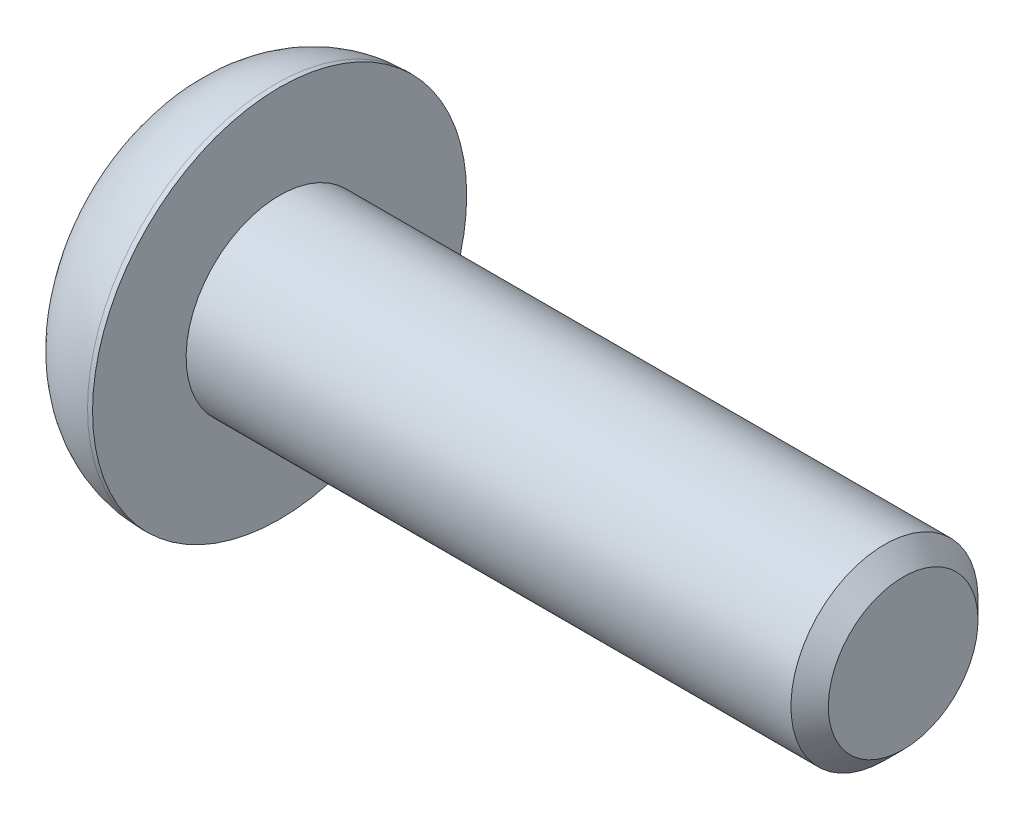
ISO-10303-21;
HEADER;
FILE_DESCRIPTION(('STEP AP214'),'2;1');
FILE_NAME('part.step','',(''),(''),'','','');
FILE_SCHEMA(('AUTOMOTIVE_DESIGN { 1 0 10303 214 1 1 1 1 }'));
ENDSEC;
DATA;
#1=APPLICATION_CONTEXT('core data for automotive mechanical design processes');
#2=APPLICATION_PROTOCOL_DEFINITION('international standard','automotive_design',2000,#1);
#3=PRODUCT_CONTEXT('',#1,'mechanical');
#4=PRODUCT('Part','Part','',(#3));
#5=PRODUCT_RELATED_PRODUCT_CATEGORY('part','',(#4));
#6=PRODUCT_DEFINITION_FORMATION('','',#4);
#7=PRODUCT_DEFINITION_CONTEXT('part definition',#1,'design');
#8=PRODUCT_DEFINITION('design','',#6,#7);
#9=PRODUCT_DEFINITION_SHAPE('','',#8);
#10=(LENGTH_UNIT() NAMED_UNIT(*) SI_UNIT(.MILLI.,.METRE.));
#11=(NAMED_UNIT(*) PLANE_ANGLE_UNIT() SI_UNIT($,.RADIAN.));
#12=(NAMED_UNIT(*) SI_UNIT($,.STERADIAN.) SOLID_ANGLE_UNIT());
#13=UNCERTAINTY_MEASURE_WITH_UNIT(LENGTH_MEASURE(1.E-05),#10,'distance_accuracy_value','');
#14=(GEOMETRIC_REPRESENTATION_CONTEXT(3) GLOBAL_UNCERTAINTY_ASSIGNED_CONTEXT((#13)) GLOBAL_UNIT_ASSIGNED_CONTEXT((#10,
#11,#12)) REPRESENTATION_CONTEXT('',''));
#15=CARTESIAN_POINT('',(0.,0.,0.));
#16=DIRECTION('',(0.,0.,1.));
#17=DIRECTION('',(1.,0.,0.));
#18=AXIS2_PLACEMENT_3D('',#15,#16,#17);
#19=CARTESIAN_POINT('',(1.66,0.,0.));
#20=DIRECTION('',(1.,0.,0.));
#21=DIRECTION('',(0.,1.,0.));
#22=AXIS2_PLACEMENT_3D('',#19,#20,#21);
#23=CYLINDRICAL_SURFACE('',#22,3.);
#24=CARTESIAN_POINT('',(1.7,0.,0.));
#25=DIRECTION('',(1.,0.,0.));
#26=DIRECTION('',(0.,-1.,0.));
#27=AXIS2_PLACEMENT_3D('',#24,#25,#26);
#28=CIRCLE('',#27,3.);
#29=CARTESIAN_POINT('',(1.7,-3.,0.));
#30=VERTEX_POINT('',#29);
#31=EDGE_CURVE('E11',#30,#30,#28,.T.);
#32=ORIENTED_EDGE('',*,*,#31,.F.);
#33=EDGE_LOOP('',(#32));
#34=FACE_BOUND('',#33,.T.);
#35=CARTESIAN_POINT('',(1.62,0.,0.));
#36=DIRECTION('',(-1.,0.,0.));
#37=DIRECTION('',(0.,0.,-1.));
#38=AXIS2_PLACEMENT_3D('',#35,#36,#37);
#39=CIRCLE('',#38,3.);
#40=CARTESIAN_POINT('',(1.62,0.,-3.));
#41=VERTEX_POINT('',#40);
#42=EDGE_CURVE('E212',#41,#41,#39,.T.);
#43=ORIENTED_EDGE('',*,*,#42,.F.);
#44=EDGE_LOOP('',(#43));
#45=FACE_BOUND('',#44,.T.);
#46=ADVANCED_FACE('F17',(#34,#45),#23,.T.);
#47=CARTESIAN_POINT('',(1.7,2.25,0.));
#48=DIRECTION('',(1.,0.,0.));
#49=DIRECTION('',(0.,-1.,0.));
#50=AXIS2_PLACEMENT_3D('',#47,#48,#49);
#51=PLANE('',#50);
#52=ORIENTED_EDGE('',*,*,#31,.T.);
#53=EDGE_LOOP('',(#52));
#54=FACE_BOUND('',#53,.T.);
#55=CARTESIAN_POINT('',(1.7,0.,0.));
#56=DIRECTION('',(-1.,0.,0.));
#57=DIRECTION('',(0.,-1.,0.));
#58=AXIS2_PLACEMENT_3D('',#55,#56,#57);
#59=CIRCLE('',#58,1.5);
#60=CARTESIAN_POINT('',(1.7,-1.5,0.));
#61=VERTEX_POINT('',#60);
#62=EDGE_CURVE('E27',#61,#61,#59,.T.);
#63=ORIENTED_EDGE('',*,*,#62,.T.);
#64=EDGE_LOOP('',(#63));
#65=FACE_BOUND('',#64,.T.);
#66=ADVANCED_FACE('F229',(#54,#65),#51,.T.);
#67=CARTESIAN_POINT('',(5.69675,0.,0.));
#68=DIRECTION('',(1.,0.,0.));
#69=DIRECTION('',(0.,1.,0.));
#70=AXIS2_PLACEMENT_3D('',#67,#68,#69);
#71=CYLINDRICAL_SURFACE('',#70,1.5);
#72=CARTESIAN_POINT('',(11.4,0.,0.));
#73=DIRECTION('',(1.,0.,0.));
#74=DIRECTION('',(0.,-1.,0.));
#75=AXIS2_PLACEMENT_3D('',#72,#73,#74);
#76=CIRCLE('',#75,1.5);
#77=CARTESIAN_POINT('',(11.4,-1.5,0.));
#78=VERTEX_POINT('',#77);
#79=EDGE_CURVE('E218',#78,#78,#76,.T.);
#80=ORIENTED_EDGE('',*,*,#79,.F.);
#81=EDGE_LOOP('',(#80));
#82=FACE_BOUND('',#81,.T.);
#83=ORIENTED_EDGE('',*,*,#62,.F.);
#84=EDGE_LOOP('',(#83));
#85=FACE_BOUND('',#84,.T.);
#86=ADVANCED_FACE('F236',(#82,#85),#71,.T.);
#87=CARTESIAN_POINT('',(11.55000000005,0.,0.));
#88=DIRECTION('',(-1.,0.,0.));
#89=DIRECTION('',(0.,0.,-1.));
#90=AXIS2_PLACEMENT_3D('',#87,#88,#89);
#91=CONICAL_SURFACE('',#90,1.349999999949,0.7853981633973);
#92=ORIENTED_EDGE('',*,*,#79,.T.);
#93=EDGE_LOOP('',(#92));
#94=FACE_BOUND('',#93,.T.);
#95=CARTESIAN_POINT('',(11.7,0.,0.));
#96=DIRECTION('',(1.,0.,0.));
#97=DIRECTION('',(0.,-1.,0.));
#98=AXIS2_PLACEMENT_3D('',#95,#96,#97);
#99=CIRCLE('',#98,1.2);
#100=CARTESIAN_POINT('',(11.7,-1.2,0.));
#101=VERTEX_POINT('',#100);
#102=EDGE_CURVE('E215',#101,#101,#99,.T.);
#103=ORIENTED_EDGE('',*,*,#102,.F.);
#104=EDGE_LOOP('',(#103));
#105=FACE_BOUND('',#104,.T.);
#106=ADVANCED_FACE('F243',(#94,#105),#91,.T.);
#107=CARTESIAN_POINT('',(11.7,0.,0.));
#108=DIRECTION('',(1.,0.,0.));
#109=DIRECTION('',(0.,1.,0.));
#110=AXIS2_PLACEMENT_3D('',#107,#108,#109);
#111=PLANE('',#110);
#112=ORIENTED_EDGE('',*,*,#102,.T.);
#113=EDGE_LOOP('',(#112));
#114=FACE_BOUND('',#113,.T.);
#115=ADVANCED_FACE('F247',(#114),#111,.T.);
#116=CARTESIAN_POINT('',(1.62000000000068,4.34114549863196E-13,0.));
#117=DIRECTION('',(-1.,0.,0.));
#118=DIRECTION('',(0.,0.,1.));
#119=AXIS2_PLACEMENT_3D('',#116,#117,#118);
#120=DEGENERATE_TOROIDAL_SURFACE('',#119,1.37999999999966,1.62000000000062,.T.);
#121=ORIENTED_EDGE('',*,*,#42,.T.);
#122=EDGE_LOOP('',(#121));
#123=FACE_BOUND('',#122,.T.);
#124=CARTESIAN_POINT('',(0.,0.,0.));
#125=DIRECTION('',(-1.,0.,0.));
#126=DIRECTION('',(0.,-1.,0.));
#127=AXIS2_PLACEMENT_3D('',#124,#125,#126);
#128=CIRCLE('',#127,1.38);
#129=CARTESIAN_POINT('',(0.,-1.38,0.));
#130=VERTEX_POINT('',#129);
#131=EDGE_CURVE('E210',#130,#130,#128,.T.);
#132=ORIENTED_EDGE('',*,*,#131,.F.);
#133=EDGE_LOOP('',(#132));
#134=FACE_BOUND('',#133,.T.);
#135=ADVANCED_FACE('F19',(#123,#134),#120,.T.);
#136=CARTESIAN_POINT('',(0.,0.69,0.));
#137=DIRECTION('',(-1.,0.,0.));
#138=DIRECTION('',(0.,1.,0.));
#139=AXIS2_PLACEMENT_3D('',#136,#137,#138);
#140=PLANE('',#139);
#141=ORIENTED_EDGE('',*,*,#131,.T.);
#142=EDGE_LOOP('',(#141));
#143=FACE_BOUND('',#142,.T.);
#144=DIRECTION('',(0.,-0.500000000000017,-0.866025403784429));
#145=VECTOR('',#144,1.);
#146=CARTESIAN_POINT('',(0.,-0.5773502691896,1.));
#147=LINE('',#146,#145);
#148=CARTESIAN_POINT('',(0.,-0.5773502691896,1.));
#149=VERTEX_POINT('',#148);
#150=CARTESIAN_POINT('',(0.,-1.154700538379,0.));
#151=VERTEX_POINT('',#150);
#152=EDGE_CURVE('E209',#149,#151,#147,.T.);
#153=ORIENTED_EDGE('',*,*,#152,.T.);
#154=DIRECTION('',(0.,0.500000000000017,-0.866025403784429));
#155=VECTOR('',#154,1.);
#156=CARTESIAN_POINT('',(0.,-1.154700538379,0.));
#157=LINE('',#156,#155);
#158=CARTESIAN_POINT('',(0.,-0.5773502691896,-1.));
#159=VERTEX_POINT('',#158);
#160=EDGE_CURVE('E36',#151,#159,#157,.T.);
#161=ORIENTED_EDGE('',*,*,#160,.T.);
#162=DIRECTION('',(0.,-1.,0.));
#163=VECTOR('',#162,1.);
#164=CARTESIAN_POINT('',(0.,0.5773502691896,-1.));
#165=LINE('',#164,#163);
#166=CARTESIAN_POINT('',(0.,0.5773502691896,-1.));
#167=VERTEX_POINT('',#166);
#168=EDGE_CURVE('E144',#167,#159,#165,.T.);
#169=ORIENTED_EDGE('',*,*,#168,.F.);
#170=DIRECTION('',(0.,0.500000000000017,0.866025403784429));
#171=VECTOR('',#170,1.);
#172=CARTESIAN_POINT('',(0.,0.5773502691896,-1.));
#173=LINE('',#172,#171);
#174=CARTESIAN_POINT('',(0.,1.154700538379,0.));
#175=VERTEX_POINT('',#174);
#176=EDGE_CURVE('E184',#167,#175,#173,.T.);
#177=ORIENTED_EDGE('',*,*,#176,.T.);
#178=DIRECTION('',(0.,-0.500000000000017,0.866025403784429));
#179=VECTOR('',#178,1.);
#180=CARTESIAN_POINT('',(0.,1.154700538379,0.));
#181=LINE('',#180,#179);
#182=CARTESIAN_POINT('',(0.,0.5773502691896,1.));
#183=VERTEX_POINT('',#182);
#184=EDGE_CURVE('E152',#175,#183,#181,.T.);
#185=ORIENTED_EDGE('',*,*,#184,.T.);
#186=DIRECTION('',(0.,1.,0.));
#187=VECTOR('',#186,1.);
#188=CARTESIAN_POINT('',(0.,-0.5773502691896,1.));
#189=LINE('',#188,#187);
#190=EDGE_CURVE('E147',#149,#183,#189,.T.);
#191=ORIENTED_EDGE('',*,*,#190,.F.);
#192=EDGE_LOOP('',(#153,#161,#169,#177,#185,#191));
#193=FACE_BOUND('',#192,.T.);
#194=ADVANCED_FACE('F189',(#143,#193),#140,.T.);
#195=CARTESIAN_POINT('',(0.,-0.5773502691896,1.));
#196=DIRECTION('',(0.,0.,1.));
#197=DIRECTION('',(0.,-1.,0.));
#198=AXIS2_PLACEMENT_3D('',#195,#196,#197);
#199=PLANE('',#198);
#200=DIRECTION('',(-1.,0.,0.));
#201=VECTOR('',#200,1.);
#202=CARTESIAN_POINT('',(1.105,0.5773502691896,1.));
#203=LINE('',#202,#201);
#204=CARTESIAN_POINT('',(1.105,0.5773502691896,1.));
#205=VERTEX_POINT('',#204);
#206=EDGE_CURVE('E138',#205,#183,#203,.T.);
#207=ORIENTED_EDGE('',*,*,#206,.F.);
#208=DIRECTION('',(0.,-1.,0.));
#209=VECTOR('',#208,1.);
#210=CARTESIAN_POINT('',(1.105,0.5773502691896,1.));
#211=LINE('',#210,#209);
#212=CARTESIAN_POINT('',(1.105,0.,1.));
#213=VERTEX_POINT('',#212);
#214=EDGE_CURVE('E149',#205,#213,#211,.T.);
#215=ORIENTED_EDGE('',*,*,#214,.T.);
#216=DIRECTION('',(0.,-1.,0.));
#217=VECTOR('',#216,1.);
#218=CARTESIAN_POINT('',(1.105,0.,1.));
#219=LINE('',#218,#217);
#220=CARTESIAN_POINT('',(1.105,-0.5773502691896,1.));
#221=VERTEX_POINT('',#220);
#222=EDGE_CURVE('E153',#213,#221,#219,.T.);
#223=ORIENTED_EDGE('',*,*,#222,.T.);
#224=DIRECTION('',(-1.,0.,0.));
#225=VECTOR('',#224,1.);
#226=CARTESIAN_POINT('',(1.105,-0.5773502691896,1.));
#227=LINE('',#226,#225);
#228=EDGE_CURVE('E156',#221,#149,#227,.T.);
#229=ORIENTED_EDGE('',*,*,#228,.T.);
#230=ORIENTED_EDGE('',*,*,#190,.T.);
#231=EDGE_LOOP('',(#207,#215,#223,#229,#230));
#232=FACE_BOUND('',#231,.T.);
#233=ADVANCED_FACE('F206',(#232),#199,.F.);
#234=CARTESIAN_POINT('',(0.,-1.154700538379,0.));
#235=DIRECTION('',(0.,-0.866025403784429,0.500000000000017));
#236=DIRECTION('',(0.,-0.500000000000017,-0.866025403784429));
#237=AXIS2_PLACEMENT_3D('',#234,#235,#236);
#238=PLANE('',#237);
#239=ORIENTED_EDGE('',*,*,#228,.F.);
#240=DIRECTION('',(0.,0.500000000000017,0.866025403784429));
#241=VECTOR('',#240,1.);
#242=CARTESIAN_POINT('',(1.105,-0.8660254037844,0.5));
#243=LINE('',#242,#241);
#244=CARTESIAN_POINT('',(1.105,-0.8660254037844,0.5));
#245=VERTEX_POINT('',#244);
#246=EDGE_CURVE('E120',#245,#221,#243,.T.);
#247=ORIENTED_EDGE('',*,*,#246,.F.);
#248=DIRECTION('',(0.,0.500000000000017,0.866025403784429));
#249=VECTOR('',#248,1.);
#250=CARTESIAN_POINT('',(1.105,-1.154700538379,0.));
#251=LINE('',#250,#249);
#252=CARTESIAN_POINT('',(1.105,-1.154700538379,0.));
#253=VERTEX_POINT('',#252);
#254=EDGE_CURVE('E110',#253,#245,#251,.T.);
#255=ORIENTED_EDGE('',*,*,#254,.F.);
#256=DIRECTION('',(-1.,0.,0.));
#257=VECTOR('',#256,1.);
#258=CARTESIAN_POINT('',(1.105,-1.154700538379,0.));
#259=LINE('',#258,#257);
#260=EDGE_CURVE('E163',#253,#151,#259,.T.);
#261=ORIENTED_EDGE('',*,*,#260,.T.);
#262=ORIENTED_EDGE('',*,*,#152,.F.);
#263=EDGE_LOOP('',(#239,#247,#255,#261,#262));
#264=FACE_BOUND('',#263,.T.);
#265=ADVANCED_FACE('F208',(#264),#238,.F.);
#266=CARTESIAN_POINT('',(0.,-0.5773502691896,-1.));
#267=DIRECTION('',(0.,-0.866025403784429,-0.500000000000017));
#268=DIRECTION('',(0.,0.500000000000017,-0.866025403784429));
#269=AXIS2_PLACEMENT_3D('',#266,#267,#268);
#270=PLANE('',#269);
#271=ORIENTED_EDGE('',*,*,#260,.F.);
#272=DIRECTION('',(0.,-0.500000000000017,0.866025403784429));
#273=VECTOR('',#272,1.);
#274=CARTESIAN_POINT('',(1.105,-0.8660254037844,-0.5));
#275=LINE('',#274,#273);
#276=CARTESIAN_POINT('',(1.105,-0.8660254037844,-0.5));
#277=VERTEX_POINT('',#276);
#278=EDGE_CURVE('E105',#277,#253,#275,.T.);
#279=ORIENTED_EDGE('',*,*,#278,.F.);
#280=DIRECTION('',(0.,-0.500000000000017,0.866025403784429));
#281=VECTOR('',#280,1.);
#282=CARTESIAN_POINT('',(1.105,-0.5773502691896,-1.));
#283=LINE('',#282,#281);
#284=CARTESIAN_POINT('',(1.105,-0.5773502691896,-1.));
#285=VERTEX_POINT('',#284);
#286=EDGE_CURVE('E116',#285,#277,#283,.T.);
#287=ORIENTED_EDGE('',*,*,#286,.F.);
#288=DIRECTION('',(-1.,0.,0.));
#289=VECTOR('',#288,1.);
#290=CARTESIAN_POINT('',(1.105,-0.5773502691896,-1.));
#291=LINE('',#290,#289);
#292=EDGE_CURVE('E165',#285,#159,#291,.T.);
#293=ORIENTED_EDGE('',*,*,#292,.T.);
#294=ORIENTED_EDGE('',*,*,#160,.F.);
#295=EDGE_LOOP('',(#271,#279,#287,#293,#294));
#296=FACE_BOUND('',#295,.T.);
#297=ADVANCED_FACE('F259',(#296),#270,.F.);
#298=CARTESIAN_POINT('',(0.,0.5773502691896,-1.));
#299=DIRECTION('',(0.,0.,-1.));
#300=DIRECTION('',(0.,1.,0.));
#301=AXIS2_PLACEMENT_3D('',#298,#299,#300);
#302=PLANE('',#301);
#303=ORIENTED_EDGE('',*,*,#292,.F.);
#304=DIRECTION('',(0.,1.,0.));
#305=VECTOR('',#304,1.);
#306=CARTESIAN_POINT('',(1.105,-0.5773502691896,-1.));
#307=LINE('',#306,#305);
#308=CARTESIAN_POINT('',(1.105,0.,-1.));
#309=VERTEX_POINT('',#308);
#310=EDGE_CURVE('E170',#285,#309,#307,.T.);
#311=ORIENTED_EDGE('',*,*,#310,.T.);
#312=DIRECTION('',(0.,1.,0.));
#313=VECTOR('',#312,1.);
#314=CARTESIAN_POINT('',(1.105,0.,-1.));
#315=LINE('',#314,#313);
#316=CARTESIAN_POINT('',(1.105,0.5773502691896,-1.));
#317=VERTEX_POINT('',#316);
#318=EDGE_CURVE('E173',#309,#317,#315,.T.);
#319=ORIENTED_EDGE('',*,*,#318,.T.);
#320=DIRECTION('',(-1.,0.,0.));
#321=VECTOR('',#320,1.);
#322=CARTESIAN_POINT('',(1.105,0.5773502691896,-1.));
#323=LINE('',#322,#321);
#324=EDGE_CURVE('E176',#317,#167,#323,.T.);
#325=ORIENTED_EDGE('',*,*,#324,.T.);
#326=ORIENTED_EDGE('',*,*,#168,.T.);
#327=EDGE_LOOP('',(#303,#311,#319,#325,#326));
#328=FACE_BOUND('',#327,.T.);
#329=ADVANCED_FACE('F262',(#328),#302,.F.);
#330=CARTESIAN_POINT('',(0.,1.154700538379,0.));
#331=DIRECTION('',(0.,0.866025403784429,-0.500000000000017));
#332=DIRECTION('',(0.,0.500000000000017,0.866025403784429));
#333=AXIS2_PLACEMENT_3D('',#330,#331,#332);
#334=PLANE('',#333);
#335=ORIENTED_EDGE('',*,*,#324,.F.);
#336=DIRECTION('',(0.,-0.500000000000017,-0.866025403784429));
#337=VECTOR('',#336,1.);
#338=CARTESIAN_POINT('',(1.105,0.8660254037844,-0.5));
#339=LINE('',#338,#337);
#340=CARTESIAN_POINT('',(1.105,0.8660254037844,-0.5));
#341=VERTEX_POINT('',#340);
#342=EDGE_CURVE('E126',#341,#317,#339,.T.);
#343=ORIENTED_EDGE('',*,*,#342,.F.);
#344=DIRECTION('',(0.,-0.500000000000017,-0.866025403784429));
#345=VECTOR('',#344,1.);
#346=CARTESIAN_POINT('',(1.105,1.154700538379,0.));
#347=LINE('',#346,#345);
#348=CARTESIAN_POINT('',(1.105,1.154700538379,0.));
#349=VERTEX_POINT('',#348);
#350=EDGE_CURVE('E123',#349,#341,#347,.T.);
#351=ORIENTED_EDGE('',*,*,#350,.F.);
#352=DIRECTION('',(-1.,0.,0.));
#353=VECTOR('',#352,1.);
#354=CARTESIAN_POINT('',(1.105,1.154700538379,0.));
#355=LINE('',#354,#353);
#356=EDGE_CURVE('E136',#349,#175,#355,.T.);
#357=ORIENTED_EDGE('',*,*,#356,.T.);
#358=ORIENTED_EDGE('',*,*,#176,.F.);
#359=EDGE_LOOP('',(#335,#343,#351,#357,#358));
#360=FACE_BOUND('',#359,.T.);
#361=ADVANCED_FACE('F194',(#360),#334,.F.);
#362=CARTESIAN_POINT('',(0.,0.5773502691896,1.));
#363=DIRECTION('',(0.,0.866025403784429,0.500000000000017));
#364=DIRECTION('',(0.,-0.500000000000017,0.866025403784429));
#365=AXIS2_PLACEMENT_3D('',#362,#363,#364);
#366=PLANE('',#365);
#367=ORIENTED_EDGE('',*,*,#356,.F.);
#368=DIRECTION('',(0.,0.500000000000017,-0.866025403784429));
#369=VECTOR('',#368,1.);
#370=CARTESIAN_POINT('',(1.105,0.8660254037844,0.5));
#371=LINE('',#370,#369);
#372=CARTESIAN_POINT('',(1.105,0.8660254037844,0.5));
#373=VERTEX_POINT('',#372);
#374=EDGE_CURVE('E90',#373,#349,#371,.T.);
#375=ORIENTED_EDGE('',*,*,#374,.F.);
#376=DIRECTION('',(0.,0.500000000000017,-0.866025403784429));
#377=VECTOR('',#376,1.);
#378=CARTESIAN_POINT('',(1.105,0.5773502691896,1.));
#379=LINE('',#378,#377);
#380=EDGE_CURVE('E107',#205,#373,#379,.T.);
#381=ORIENTED_EDGE('',*,*,#380,.F.);
#382=ORIENTED_EDGE('',*,*,#206,.T.);
#383=ORIENTED_EDGE('',*,*,#184,.F.);
#384=EDGE_LOOP('',(#367,#375,#381,#382,#383));
#385=FACE_BOUND('',#384,.T.);
#386=ADVANCED_FACE('F192',(#385),#366,.F.);
#387=CARTESIAN_POINT('',(1.105,0.,0.));
#388=DIRECTION('',(1.,0.,0.));
#389=DIRECTION('',(0.,0.,-1.));
#390=AXIS2_PLACEMENT_3D('',#387,#388,#389);
#391=PLANE('',#390);
#392=ORIENTED_EDGE('',*,*,#214,.F.);
#393=ORIENTED_EDGE('',*,*,#380,.T.);
#394=CARTESIAN_POINT('',(1.105,0.,0.));
#395=DIRECTION('',(1.,0.,0.));
#396=DIRECTION('',(0.,0.866025403784429,0.500000000000017));
#397=AXIS2_PLACEMENT_3D('',#394,#395,#396);
#398=CIRCLE('',#397,1.);
#399=EDGE_CURVE('E104',#373,#213,#398,.T.);
#400=ORIENTED_EDGE('',*,*,#399,.T.);
#401=EDGE_LOOP('',(#392,#393,#400));
#402=FACE_BOUND('',#401,.T.);
#403=ADVANCED_FACE('F202',(#402),#391,.F.);
#404=CARTESIAN_POINT('',(0.5613248654052,0.,0.));
#405=DIRECTION('',(1.,0.,0.));
#406=DIRECTION('',(0.,1.,0.));
#407=AXIS2_PLACEMENT_3D('',#404,#405,#406);
#408=CYLINDRICAL_SURFACE('',#407,1.);
#409=CARTESIAN_POINT('',(1.105,0.,0.));
#410=DIRECTION('',(1.,0.,0.));
#411=DIRECTION('',(0.,1.,0.));
#412=AXIS2_PLACEMENT_3D('',#409,#410,#411);
#413=CIRCLE('',#412,1.);
#414=EDGE_CURVE('E121',#341,#373,#413,.T.);
#415=ORIENTED_EDGE('',*,*,#414,.F.);
#416=CARTESIAN_POINT('',(1.105,0.,0.));
#417=DIRECTION('',(1.,0.,0.));
#418=DIRECTION('',(0.,0.,-1.));
#419=AXIS2_PLACEMENT_3D('',#416,#417,#418);
#420=CIRCLE('',#419,1.);
#421=EDGE_CURVE('E124',#309,#341,#420,.T.);
#422=ORIENTED_EDGE('',*,*,#421,.F.);
#423=CARTESIAN_POINT('',(1.105,0.,0.));
#424=DIRECTION('',(1.,0.,0.));
#425=DIRECTION('',(0.,-0.866025403784429,-0.500000000000017));
#426=AXIS2_PLACEMENT_3D('',#423,#424,#425);
#427=CIRCLE('',#426,1.);
#428=EDGE_CURVE('E21',#277,#309,#427,.T.);
#429=ORIENTED_EDGE('',*,*,#428,.F.);
#430=CARTESIAN_POINT('',(1.105,0.,0.));
#431=DIRECTION('',(1.,0.,0.));
#432=DIRECTION('',(0.,-0.866025403784429,0.500000000000017));
#433=AXIS2_PLACEMENT_3D('',#430,#431,#432);
#434=CIRCLE('',#433,1.);
#435=EDGE_CURVE('E114',#245,#277,#434,.T.);
#436=ORIENTED_EDGE('',*,*,#435,.F.);
#437=CARTESIAN_POINT('',(1.105,0.,0.));
#438=DIRECTION('',(1.,0.,0.));
#439=DIRECTION('',(0.,0.,1.));
#440=AXIS2_PLACEMENT_3D('',#437,#438,#439);
#441=CIRCLE('',#440,1.);
#442=EDGE_CURVE('E117',#213,#245,#441,.T.);
#443=ORIENTED_EDGE('',*,*,#442,.F.);
#444=ORIENTED_EDGE('',*,*,#399,.F.);
#445=EDGE_LOOP('',(#415,#422,#429,#436,#443,#444));
#446=FACE_BOUND('',#445,.T.);
#447=CARTESIAN_POINT('',(1.12264973081,0.,0.));
#448=DIRECTION('',(-1.,0.,0.));
#449=DIRECTION('',(0.,-1.,0.));
#450=AXIS2_PLACEMENT_3D('',#447,#448,#449);
#451=CIRCLE('',#450,1.);
#452=CARTESIAN_POINT('',(1.12264973081,-1.,0.));
#453=VERTEX_POINT('',#452);
#454=EDGE_CURVE('E102',#453,#453,#451,.T.);
#455=ORIENTED_EDGE('',*,*,#454,.F.);
#456=EDGE_LOOP('',(#455));
#457=FACE_BOUND('',#456,.T.);
#458=ADVANCED_FACE('F98',(#446,#457),#408,.F.);
#459=CARTESIAN_POINT('',(1.405551362713,0.,0.));
#460=DIRECTION('',(-1.,0.,0.));
#461=DIRECTION('',(0.,1.,0.));
#462=AXIS2_PLACEMENT_3D('',#459,#460,#461);
#463=CONICAL_SURFACE('',#462,0.51,1.0471975511964);
#464=CARTESIAN_POINT('',(1.7,0.,0.));
#465=VERTEX_POINT('',#464);
#466=VERTEX_LOOP('',#465);
#467=FACE_BOUND('',#466,.T.);
#468=ORIENTED_EDGE('',*,*,#454,.T.);
#469=EDGE_LOOP('',(#468));
#470=FACE_BOUND('',#469,.T.);
#471=ADVANCED_FACE('F94',(#467,#470),#463,.F.);
#472=CARTESIAN_POINT('',(1.105,0.,0.));
#473=DIRECTION('',(1.,0.,0.));
#474=DIRECTION('',(0.,0.,-1.));
#475=AXIS2_PLACEMENT_3D('',#472,#473,#474);
#476=PLANE('',#475);
#477=ORIENTED_EDGE('',*,*,#278,.T.);
#478=ORIENTED_EDGE('',*,*,#254,.T.);
#479=ORIENTED_EDGE('',*,*,#435,.T.);
#480=EDGE_LOOP('',(#477,#478,#479));
#481=FACE_BOUND('',#480,.T.);
#482=ADVANCED_FACE('F97',(#481),#476,.F.);
#483=CARTESIAN_POINT('',(1.105,0.,0.));
#484=DIRECTION('',(1.,0.,0.));
#485=DIRECTION('',(0.,0.,-1.));
#486=AXIS2_PLACEMENT_3D('',#483,#484,#485);
#487=PLANE('',#486);
#488=ORIENTED_EDGE('',*,*,#310,.F.);
#489=ORIENTED_EDGE('',*,*,#286,.T.);
#490=ORIENTED_EDGE('',*,*,#428,.T.);
#491=EDGE_LOOP('',(#488,#489,#490));
#492=FACE_BOUND('',#491,.T.);
#493=ADVANCED_FACE('F275',(#492),#487,.F.);
#494=CARTESIAN_POINT('',(1.105,0.,0.));
#495=DIRECTION('',(1.,0.,0.));
#496=DIRECTION('',(0.,0.,-1.));
#497=AXIS2_PLACEMENT_3D('',#494,#495,#496);
#498=PLANE('',#497);
#499=ORIENTED_EDGE('',*,*,#342,.T.);
#500=ORIENTED_EDGE('',*,*,#318,.F.);
#501=ORIENTED_EDGE('',*,*,#421,.T.);
#502=EDGE_LOOP('',(#499,#500,#501));
#503=FACE_BOUND('',#502,.T.);
#504=ADVANCED_FACE('F279',(#503),#498,.F.);
#505=CARTESIAN_POINT('',(1.105,0.,0.));
#506=DIRECTION('',(1.,0.,0.));
#507=DIRECTION('',(0.,0.,-1.));
#508=AXIS2_PLACEMENT_3D('',#505,#506,#507);
#509=PLANE('',#508);
#510=ORIENTED_EDGE('',*,*,#374,.T.);
#511=ORIENTED_EDGE('',*,*,#350,.T.);
#512=ORIENTED_EDGE('',*,*,#414,.T.);
#513=EDGE_LOOP('',(#510,#511,#512));
#514=FACE_BOUND('',#513,.T.);
#515=ADVANCED_FACE('F196',(#514),#509,.F.);
#516=CARTESIAN_POINT('',(1.105,0.,0.));
#517=DIRECTION('',(1.,0.,0.));
#518=DIRECTION('',(0.,0.,-1.));
#519=AXIS2_PLACEMENT_3D('',#516,#517,#518);
#520=PLANE('',#519);
#521=ORIENTED_EDGE('',*,*,#246,.T.);
#522=ORIENTED_EDGE('',*,*,#222,.F.);
#523=ORIENTED_EDGE('',*,*,#442,.T.);
#524=EDGE_LOOP('',(#521,#522,#523));
#525=FACE_BOUND('',#524,.T.);
#526=ADVANCED_FACE('F204',(#525),#520,.F.);
#527=CLOSED_SHELL('',(#46,#66,#86,#106,#115,#135,#194,#233,#265,#297,#329,#361,#386,#403,#458,
#471,#482,#493,#504,#515,#526));
#528=MANIFOLD_SOLID_BREP('B1',#527);
#529=ADVANCED_BREP_SHAPE_REPRESENTATION('',(#18,#528),#14);
#530=SHAPE_DEFINITION_REPRESENTATION(#9,#529);
ENDSEC;
END-ISO-10303-21;
